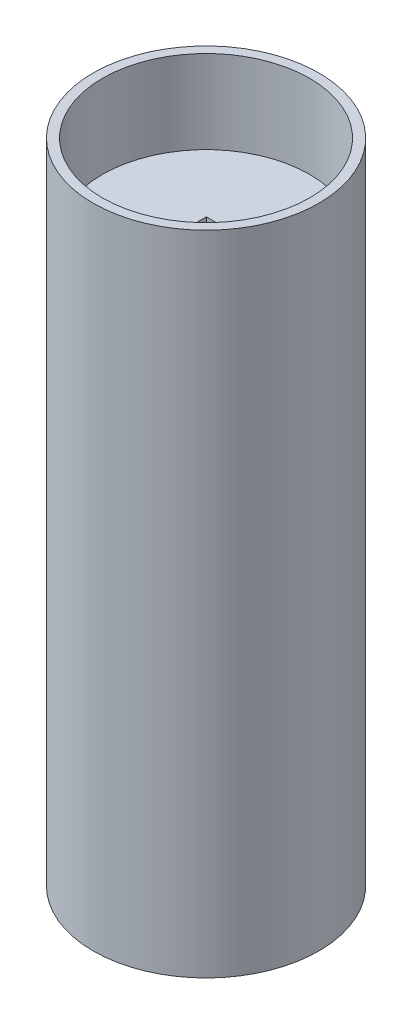
ISO-10303-21;
HEADER;
FILE_DESCRIPTION(('STEP AP214'),'2;1');
FILE_NAME('part.step','',(''),(''),'','','');
FILE_SCHEMA(('AUTOMOTIVE_DESIGN { 1 0 10303 214 1 1 1 1 }'));
ENDSEC;
DATA;
#1=APPLICATION_CONTEXT('core data for automotive mechanical design processes');
#2=APPLICATION_PROTOCOL_DEFINITION('international standard','automotive_design',2000,#1);
#3=PRODUCT_CONTEXT('',#1,'mechanical');
#4=PRODUCT('Part','Part','',(#3));
#5=PRODUCT_RELATED_PRODUCT_CATEGORY('part','',(#4));
#6=PRODUCT_DEFINITION_FORMATION('','',#4);
#7=PRODUCT_DEFINITION_CONTEXT('part definition',#1,'design');
#8=PRODUCT_DEFINITION('design','',#6,#7);
#9=PRODUCT_DEFINITION_SHAPE('','',#8);
#10=(LENGTH_UNIT() NAMED_UNIT(*) SI_UNIT(.MILLI.,.METRE.));
#11=(NAMED_UNIT(*) PLANE_ANGLE_UNIT() SI_UNIT($,.RADIAN.));
#12=(NAMED_UNIT(*) SI_UNIT($,.STERADIAN.) SOLID_ANGLE_UNIT());
#13=UNCERTAINTY_MEASURE_WITH_UNIT(LENGTH_MEASURE(1.E-05),#10,'distance_accuracy_value','');
#14=(GEOMETRIC_REPRESENTATION_CONTEXT(3) GLOBAL_UNCERTAINTY_ASSIGNED_CONTEXT((#13)) GLOBAL_UNIT_ASSIGNED_CONTEXT((#10,
#11,#12)) REPRESENTATION_CONTEXT('',''));
#15=CARTESIAN_POINT('',(0.,0.,0.));
#16=DIRECTION('',(0.,0.,1.));
#17=DIRECTION('',(1.,0.,0.));
#18=AXIS2_PLACEMENT_3D('',#15,#16,#17);
#19=CARTESIAN_POINT('',(0.,-15.,0.));
#20=DIRECTION('',(0.,-1.,0.));
#21=DIRECTION('',(0.,0.,-1.));
#22=AXIS2_PLACEMENT_3D('',#19,#20,#21);
#23=CYLINDRICAL_SURFACE('',#22,56.);
#24=CARTESIAN_POINT('',(0.,-15.,0.));
#25=DIRECTION('',(0.,1.,0.));
#26=DIRECTION('',(0.,0.,1.));
#27=AXIS2_PLACEMENT_3D('',#24,#25,#26);
#28=CIRCLE('',#27,56.);
#29=CARTESIAN_POINT('',(0.,-15.,56.));
#30=VERTEX_POINT('',#29);
#31=EDGE_CURVE('E11',#30,#30,#28,.T.);
#32=ORIENTED_EDGE('',*,*,#31,.F.);
#33=EDGE_LOOP('',(#32));
#34=FACE_BOUND('',#33,.T.);
#35=CARTESIAN_POINT('',(0.,-20.,0.));
#36=DIRECTION('',(0.,1.,0.));
#37=DIRECTION('',(0.,0.,1.));
#38=AXIS2_PLACEMENT_3D('',#35,#36,#37);
#39=CIRCLE('',#38,56.);
#40=CARTESIAN_POINT('',(0.,-20.,56.));
#41=VERTEX_POINT('',#40);
#42=EDGE_CURVE('E50',#41,#41,#39,.T.);
#43=ORIENTED_EDGE('',*,*,#42,.T.);
#44=EDGE_LOOP('',(#43));
#45=FACE_BOUND('',#44,.T.);
#46=ADVANCED_FACE('F47',(#34,#45),#23,.T.);
#47=CARTESIAN_POINT('',(0.,-15.,0.));
#48=DIRECTION('',(0.,1.,0.));
#49=DIRECTION('',(0.,0.,1.));
#50=AXIS2_PLACEMENT_3D('',#47,#48,#49);
#51=PLANE('',#50);
#52=ORIENTED_EDGE('',*,*,#31,.T.);
#53=EDGE_LOOP('',(#52));
#54=FACE_BOUND('',#53,.T.);
#55=ADVANCED_FACE('F62',(#54),#51,.T.);
#56=CARTESIAN_POINT('',(0.,-20.,0.));
#57=DIRECTION('',(0.,1.,0.));
#58=DIRECTION('',(0.,0.,1.));
#59=AXIS2_PLACEMENT_3D('',#56,#57,#58);
#60=PLANE('',#59);
#61=ORIENTED_EDGE('',*,*,#42,.F.);
#62=EDGE_LOOP('',(#61));
#63=FACE_BOUND('',#62,.T.);
#64=ADVANCED_FACE('F60',(#63),#60,.F.);
#65=CLOSED_SHELL('',(#46,#55,#64));
#66=MANIFOLD_SOLID_BREP('B2',#65);
#67=CARTESIAN_POINT('',(0.,250.,0.));
#68=DIRECTION('',(0.,1.,0.));
#69=DIRECTION('',(0.,0.,1.));
#70=AXIS2_PLACEMENT_3D('',#67,#68,#69);
#71=PLANE('',#70);
#72=CARTESIAN_POINT('',(0.,250.,0.));
#73=DIRECTION('',(0.,1.,0.));
#74=DIRECTION('',(0.,0.,1.));
#75=AXIS2_PLACEMENT_3D('',#72,#73,#74);
#76=CIRCLE('',#75,56.);
#77=CARTESIAN_POINT('',(0.,250.,56.));
#78=VERTEX_POINT('',#77);
#79=EDGE_CURVE('E148',#78,#78,#76,.T.);
#80=ORIENTED_EDGE('',*,*,#79,.F.);
#81=EDGE_LOOP('',(#80));
#82=FACE_BOUND('',#81,.T.);
#83=DIRECTION('',(1.,0.,0.));
#84=VECTOR('',#83,1.);
#85=CARTESIAN_POINT('',(-8.075,250.,-8.215));
#86=LINE('',#85,#84);
#87=CARTESIAN_POINT('',(-8.075,250.,-8.215));
#88=VERTEX_POINT('',#87);
#89=CARTESIAN_POINT('',(8.075,250.,-8.215));
#90=VERTEX_POINT('',#89);
#91=EDGE_CURVE('E143',#88,#90,#86,.T.);
#92=ORIENTED_EDGE('',*,*,#91,.F.);
#93=DIRECTION('',(0.,0.,-1.));
#94=VECTOR('',#93,1.);
#95=CARTESIAN_POINT('',(-8.075,250.,-8.215));
#96=LINE('',#95,#94);
#97=CARTESIAN_POINT('',(-8.075,250.,8.215));
#98=VERTEX_POINT('',#97);
#99=EDGE_CURVE('E154',#98,#88,#96,.T.);
#100=ORIENTED_EDGE('',*,*,#99,.F.);
#101=DIRECTION('',(-1.,0.,0.));
#102=VECTOR('',#101,1.);
#103=CARTESIAN_POINT('',(-8.075,250.,8.215));
#104=LINE('',#103,#102);
#105=CARTESIAN_POINT('',(8.075,250.,8.215));
#106=VERTEX_POINT('',#105);
#107=EDGE_CURVE('E103',#106,#98,#104,.T.);
#108=ORIENTED_EDGE('',*,*,#107,.F.);
#109=DIRECTION('',(0.,0.,1.));
#110=VECTOR('',#109,1.);
#111=CARTESIAN_POINT('',(8.075,250.,-8.215));
#112=LINE('',#111,#110);
#113=EDGE_CURVE('E133',#90,#106,#112,.T.);
#114=ORIENTED_EDGE('',*,*,#113,.F.);
#115=EDGE_LOOP('',(#92,#100,#108,#114));
#116=FACE_BOUND('',#115,.T.);
#117=ADVANCED_FACE('F88',(#82,#116),#71,.F.);
#118=CARTESIAN_POINT('',(0.,300.,0.));
#119=DIRECTION('',(0.,-1.,0.));
#120=DIRECTION('',(0.,0.,-1.));
#121=AXIS2_PLACEMENT_3D('',#118,#119,#120);
#122=CYLINDRICAL_SURFACE('',#121,56.);
#123=ORIENTED_EDGE('',*,*,#79,.T.);
#124=EDGE_LOOP('',(#123));
#125=FACE_BOUND('',#124,.T.);
#126=CARTESIAN_POINT('',(0.,-50.,0.));
#127=DIRECTION('',(0.,1.,0.));
#128=DIRECTION('',(0.,0.,1.));
#129=AXIS2_PLACEMENT_3D('',#126,#127,#128);
#130=CIRCLE('',#129,56.);
#131=CARTESIAN_POINT('',(0.,-50.,56.));
#132=VERTEX_POINT('',#131);
#133=EDGE_CURVE('E182',#132,#132,#130,.T.);
#134=ORIENTED_EDGE('',*,*,#133,.F.);
#135=EDGE_LOOP('',(#134));
#136=FACE_BOUND('',#135,.T.);
#137=ADVANCED_FACE('F190',(#125,#136),#122,.F.);
#138=CARTESIAN_POINT('',(0.,255.,0.));
#139=DIRECTION('',(0.,1.,0.));
#140=DIRECTION('',(0.,0.,1.));
#141=AXIS2_PLACEMENT_3D('',#138,#139,#140);
#142=CIRCLE('',#141,56.);
#143=CARTESIAN_POINT('',(0.,255.,56.));
#144=VERTEX_POINT('',#143);
#145=EDGE_CURVE('E45',#144,#144,#142,.T.);
#146=ORIENTED_EDGE('',*,*,#145,.F.);
#147=EDGE_LOOP('',(#146));
#148=FACE_BOUND('',#147,.T.);
#149=CARTESIAN_POINT('',(0.,300.,0.));
#150=DIRECTION('',(0.,1.,0.));
#151=DIRECTION('',(0.,0.,1.));
#152=AXIS2_PLACEMENT_3D('',#149,#150,#151);
#153=CIRCLE('',#152,56.);
#154=CARTESIAN_POINT('',(0.,300.,56.));
#155=VERTEX_POINT('',#154);
#156=EDGE_CURVE('E168',#155,#155,#153,.T.);
#157=ORIENTED_EDGE('',*,*,#156,.T.);
#158=EDGE_LOOP('',(#157));
#159=FACE_BOUND('',#158,.T.);
#160=ADVANCED_FACE('F90',(#148,#159),#122,.F.);
#161=CARTESIAN_POINT('',(0.,300.,0.));
#162=DIRECTION('',(0.,-1.,0.));
#163=DIRECTION('',(0.,0.,-1.));
#164=AXIS2_PLACEMENT_3D('',#161,#162,#163);
#165=CYLINDRICAL_SURFACE('',#164,61.);
#166=CARTESIAN_POINT('',(0.,300.,0.));
#167=DIRECTION('',(0.,1.,0.));
#168=DIRECTION('',(0.,0.,1.));
#169=AXIS2_PLACEMENT_3D('',#166,#167,#168);
#170=CIRCLE('',#169,61.);
#171=CARTESIAN_POINT('',(0.,300.,61.));
#172=VERTEX_POINT('',#171);
#173=EDGE_CURVE('E96',#172,#172,#170,.T.);
#174=ORIENTED_EDGE('',*,*,#173,.F.);
#175=EDGE_LOOP('',(#174));
#176=FACE_BOUND('',#175,.T.);
#177=CARTESIAN_POINT('',(0.,-50.,0.));
#178=DIRECTION('',(0.,1.,0.));
#179=DIRECTION('',(0.,0.,1.));
#180=AXIS2_PLACEMENT_3D('',#177,#178,#179);
#181=CIRCLE('',#180,61.);
#182=CARTESIAN_POINT('',(0.,-50.,61.));
#183=VERTEX_POINT('',#182);
#184=EDGE_CURVE('E180',#183,#183,#181,.T.);
#185=ORIENTED_EDGE('',*,*,#184,.T.);
#186=EDGE_LOOP('',(#185));
#187=FACE_BOUND('',#186,.T.);
#188=ADVANCED_FACE('F175',(#176,#187),#165,.T.);
#189=CARTESIAN_POINT('',(0.,300.,0.));
#190=DIRECTION('',(0.,1.,0.));
#191=DIRECTION('',(0.,0.,1.));
#192=AXIS2_PLACEMENT_3D('',#189,#190,#191);
#193=PLANE('',#192);
#194=ORIENTED_EDGE('',*,*,#156,.F.);
#195=EDGE_LOOP('',(#194));
#196=FACE_BOUND('',#195,.T.);
#197=ORIENTED_EDGE('',*,*,#173,.T.);
#198=EDGE_LOOP('',(#197));
#199=FACE_BOUND('',#198,.T.);
#200=ADVANCED_FACE('F173',(#196,#199),#193,.T.);
#201=CARTESIAN_POINT('',(0.,255.,0.));
#202=DIRECTION('',(0.,1.,0.));
#203=DIRECTION('',(0.,0.,1.));
#204=AXIS2_PLACEMENT_3D('',#201,#202,#203);
#205=PLANE('',#204);
#206=DIRECTION('',(0.,0.,-1.));
#207=VECTOR('',#206,1.);
#208=CARTESIAN_POINT('',(8.075,255.,-8.215));
#209=LINE('',#208,#207);
#210=CARTESIAN_POINT('',(8.075,255.,8.215));
#211=VERTEX_POINT('',#210);
#212=CARTESIAN_POINT('',(8.075,255.,-8.215));
#213=VERTEX_POINT('',#212);
#214=EDGE_CURVE('E135',#211,#213,#209,.T.);
#215=ORIENTED_EDGE('',*,*,#214,.F.);
#216=DIRECTION('',(1.,0.,0.));
#217=VECTOR('',#216,1.);
#218=CARTESIAN_POINT('',(-8.075,255.,8.215));
#219=LINE('',#218,#217);
#220=CARTESIAN_POINT('',(-8.075,255.,8.215));
#221=VERTEX_POINT('',#220);
#222=EDGE_CURVE('E140',#221,#211,#219,.T.);
#223=ORIENTED_EDGE('',*,*,#222,.F.);
#224=DIRECTION('',(0.,0.,1.));
#225=VECTOR('',#224,1.);
#226=CARTESIAN_POINT('',(-8.075,255.,-8.215));
#227=LINE('',#226,#225);
#228=CARTESIAN_POINT('',(-8.075,255.,-8.215));
#229=VERTEX_POINT('',#228);
#230=EDGE_CURVE('E110',#229,#221,#227,.T.);
#231=ORIENTED_EDGE('',*,*,#230,.F.);
#232=DIRECTION('',(-1.,0.,0.));
#233=VECTOR('',#232,1.);
#234=CARTESIAN_POINT('',(-8.075,255.,-8.215));
#235=LINE('',#234,#233);
#236=EDGE_CURVE('E152',#213,#229,#235,.T.);
#237=ORIENTED_EDGE('',*,*,#236,.F.);
#238=EDGE_LOOP('',(#215,#223,#231,#237));
#239=FACE_BOUND('',#238,.T.);
#240=ORIENTED_EDGE('',*,*,#145,.T.);
#241=EDGE_LOOP('',(#240));
#242=FACE_BOUND('',#241,.T.);
#243=ADVANCED_FACE('F205',(#239,#242),#205,.T.);
#244=CARTESIAN_POINT('',(8.075,-20.001,-8.215));
#245=DIRECTION('',(1.,0.,0.));
#246=DIRECTION('',(0.,0.,-1.));
#247=AXIS2_PLACEMENT_3D('',#244,#245,#246);
#248=PLANE('',#247);
#249=ORIENTED_EDGE('',*,*,#113,.T.);
#250=DIRECTION('',(0.,1.,0.));
#251=VECTOR('',#250,1.);
#252=CARTESIAN_POINT('',(8.075,-20.001,8.215));
#253=LINE('',#252,#251);
#254=EDGE_CURVE('E149',#106,#211,#253,.T.);
#255=ORIENTED_EDGE('',*,*,#254,.T.);
#256=ORIENTED_EDGE('',*,*,#214,.T.);
#257=DIRECTION('',(0.,1.,0.));
#258=VECTOR('',#257,1.);
#259=CARTESIAN_POINT('',(8.075,-20.001,-8.215));
#260=LINE('',#259,#258);
#261=EDGE_CURVE('E129',#90,#213,#260,.T.);
#262=ORIENTED_EDGE('',*,*,#261,.F.);
#263=EDGE_LOOP('',(#249,#255,#256,#262));
#264=FACE_BOUND('',#263,.T.);
#265=ADVANCED_FACE('F131',(#264),#248,.F.);
#266=CARTESIAN_POINT('',(-8.075,-20.001,8.215));
#267=DIRECTION('',(0.,0.,1.));
#268=DIRECTION('',(1.,0.,0.));
#269=AXIS2_PLACEMENT_3D('',#266,#267,#268);
#270=PLANE('',#269);
#271=ORIENTED_EDGE('',*,*,#107,.T.);
#272=DIRECTION('',(0.,1.,0.));
#273=VECTOR('',#272,1.);
#274=CARTESIAN_POINT('',(-8.075,-20.001,8.215));
#275=LINE('',#274,#273);
#276=EDGE_CURVE('E163',#98,#221,#275,.T.);
#277=ORIENTED_EDGE('',*,*,#276,.T.);
#278=ORIENTED_EDGE('',*,*,#222,.T.);
#279=ORIENTED_EDGE('',*,*,#254,.F.);
#280=EDGE_LOOP('',(#271,#277,#278,#279));
#281=FACE_BOUND('',#280,.T.);
#282=ADVANCED_FACE('F218',(#281),#270,.F.);
#283=CARTESIAN_POINT('',(-8.075,-20.001,-8.215));
#284=DIRECTION('',(-1.,0.,0.));
#285=DIRECTION('',(0.,0.,1.));
#286=AXIS2_PLACEMENT_3D('',#283,#284,#285);
#287=PLANE('',#286);
#288=ORIENTED_EDGE('',*,*,#99,.T.);
#289=DIRECTION('',(0.,1.,0.));
#290=VECTOR('',#289,1.);
#291=CARTESIAN_POINT('',(-8.075,-20.001,-8.215));
#292=LINE('',#291,#290);
#293=EDGE_CURVE('E139',#88,#229,#292,.T.);
#294=ORIENTED_EDGE('',*,*,#293,.T.);
#295=ORIENTED_EDGE('',*,*,#230,.T.);
#296=ORIENTED_EDGE('',*,*,#276,.F.);
#297=EDGE_LOOP('',(#288,#294,#295,#296));
#298=FACE_BOUND('',#297,.T.);
#299=ADVANCED_FACE('F222',(#298),#287,.F.);
#300=CARTESIAN_POINT('',(-8.075,-20.001,-8.215));
#301=DIRECTION('',(0.,0.,-1.));
#302=DIRECTION('',(-1.,0.,0.));
#303=AXIS2_PLACEMENT_3D('',#300,#301,#302);
#304=PLANE('',#303);
#305=ORIENTED_EDGE('',*,*,#91,.T.);
#306=ORIENTED_EDGE('',*,*,#261,.T.);
#307=ORIENTED_EDGE('',*,*,#236,.T.);
#308=ORIENTED_EDGE('',*,*,#293,.F.);
#309=EDGE_LOOP('',(#305,#306,#307,#308));
#310=FACE_BOUND('',#309,.T.);
#311=ADVANCED_FACE('F144',(#310),#304,.F.);
#312=CARTESIAN_POINT('',(0.,-50.,0.));
#313=DIRECTION('',(0.,1.,0.));
#314=DIRECTION('',(0.,0.,1.));
#315=AXIS2_PLACEMENT_3D('',#312,#313,#314);
#316=PLANE('',#315);
#317=ORIENTED_EDGE('',*,*,#133,.T.);
#318=EDGE_LOOP('',(#317));
#319=FACE_BOUND('',#318,.T.);
#320=ORIENTED_EDGE('',*,*,#184,.F.);
#321=EDGE_LOOP('',(#320));
#322=FACE_BOUND('',#321,.T.);
#323=ADVANCED_FACE('F188',(#319,#322),#316,.F.);
#324=CLOSED_SHELL('',(#117,#137,#160,#188,#200,#243,#265,#282,#299,#311,#323));
#325=MANIFOLD_SOLID_BREP('B6',#324);
#326=ADVANCED_BREP_SHAPE_REPRESENTATION('',(#18,#66,#325),#14);
#327=SHAPE_DEFINITION_REPRESENTATION(#9,#326);
ENDSEC;
END-ISO-10303-21;
